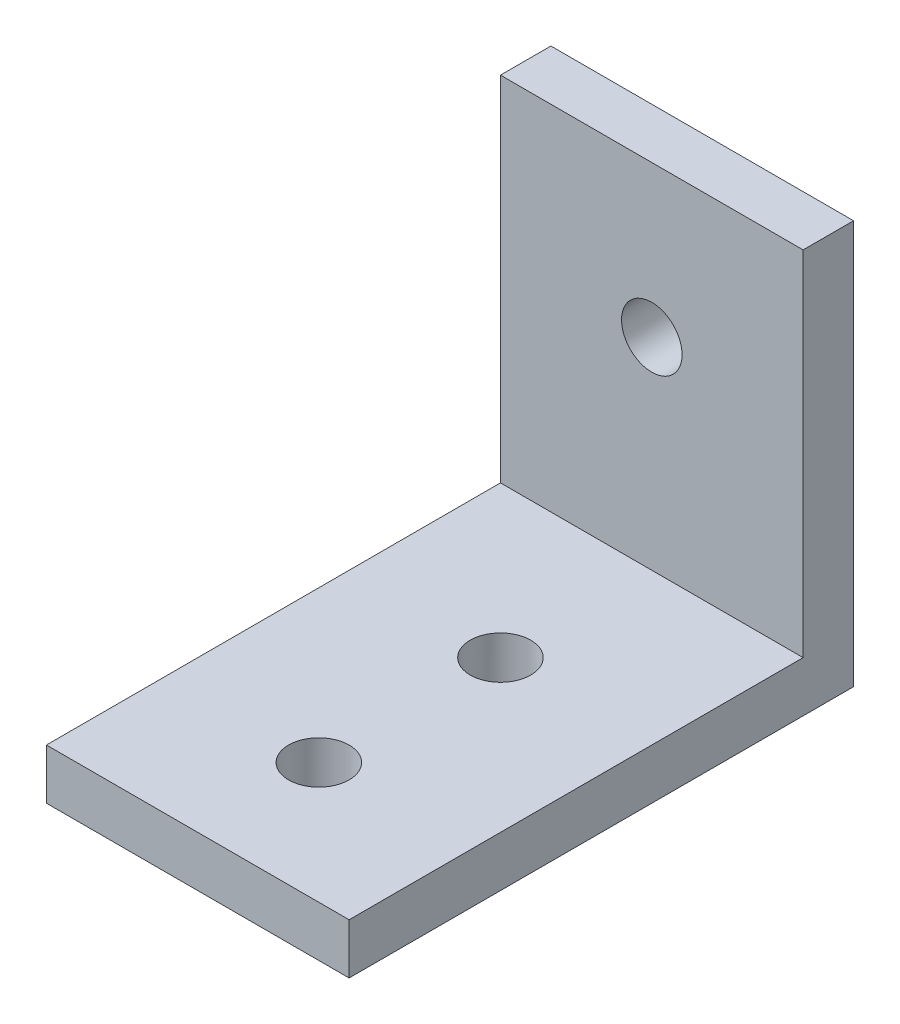
ISO-10303-21;
HEADER;
FILE_DESCRIPTION(('STEP AP214'),'2;1');
FILE_NAME('part.step','',(''),(''),'','','');
FILE_SCHEMA(('AUTOMOTIVE_DESIGN { 1 0 10303 214 1 1 1 1 }'));
ENDSEC;
DATA;
#1=APPLICATION_CONTEXT('core data for automotive mechanical design processes');
#2=APPLICATION_PROTOCOL_DEFINITION('international standard','automotive_design',2000,#1);
#3=PRODUCT_CONTEXT('',#1,'mechanical');
#4=PRODUCT('Part','Part','',(#3));
#5=PRODUCT_RELATED_PRODUCT_CATEGORY('part','',(#4));
#6=PRODUCT_DEFINITION_FORMATION('','',#4);
#7=PRODUCT_DEFINITION_CONTEXT('part definition',#1,'design');
#8=PRODUCT_DEFINITION('design','',#6,#7);
#9=PRODUCT_DEFINITION_SHAPE('','',#8);
#10=(LENGTH_UNIT() NAMED_UNIT(*) SI_UNIT(.MILLI.,.METRE.));
#11=(NAMED_UNIT(*) PLANE_ANGLE_UNIT() SI_UNIT($,.RADIAN.));
#12=(NAMED_UNIT(*) SI_UNIT($,.STERADIAN.) SOLID_ANGLE_UNIT());
#13=UNCERTAINTY_MEASURE_WITH_UNIT(LENGTH_MEASURE(1.E-05),#10,'distance_accuracy_value','');
#14=(GEOMETRIC_REPRESENTATION_CONTEXT(3) GLOBAL_UNCERTAINTY_ASSIGNED_CONTEXT((#13)) GLOBAL_UNIT_ASSIGNED_CONTEXT((#10,
#11,#12)) REPRESENTATION_CONTEXT('',''));
#15=CARTESIAN_POINT('',(0.,0.,0.));
#16=DIRECTION('',(0.,0.,1.));
#17=DIRECTION('',(1.,0.,0.));
#18=AXIS2_PLACEMENT_3D('',#15,#16,#17);
#19=CARTESIAN_POINT('',(-15.,5.,50.));
#20=DIRECTION('',(1.,0.,0.));
#21=DIRECTION('',(0.,0.,-1.));
#22=AXIS2_PLACEMENT_3D('',#19,#20,#21);
#23=PLANE('',#22);
#24=DIRECTION('',(0.,0.,1.));
#25=VECTOR('',#24,1.);
#26=CARTESIAN_POINT('',(-15.,5.,50.));
#27=LINE('',#26,#25);
#28=CARTESIAN_POINT('',(-15.,5.,5.));
#29=VERTEX_POINT('',#28);
#30=CARTESIAN_POINT('',(-15.,5.,50.));
#31=VERTEX_POINT('',#30);
#32=EDGE_CURVE('E142',#29,#31,#27,.T.);
#33=ORIENTED_EDGE('',*,*,#32,.F.);
#34=DIRECTION('',(0.,-1.,0.));
#35=VECTOR('',#34,1.);
#36=CARTESIAN_POINT('',(-15.,40.,5.));
#37=LINE('',#36,#35);
#38=CARTESIAN_POINT('',(-15.,40.,5.));
#39=VERTEX_POINT('',#38);
#40=EDGE_CURVE('E112',#39,#29,#37,.T.);
#41=ORIENTED_EDGE('',*,*,#40,.F.);
#42=DIRECTION('',(0.,0.,-1.));
#43=VECTOR('',#42,1.);
#44=CARTESIAN_POINT('',(-15.,40.,5.));
#45=LINE('',#44,#43);
#46=CARTESIAN_POINT('',(-15.,40.,0.));
#47=VERTEX_POINT('',#46);
#48=EDGE_CURVE('E123',#39,#47,#45,.T.);
#49=ORIENTED_EDGE('',*,*,#48,.T.);
#50=DIRECTION('',(0.,-1.,0.));
#51=VECTOR('',#50,1.);
#52=CARTESIAN_POINT('',(-15.,5.,0.));
#53=LINE('',#52,#51);
#54=CARTESIAN_POINT('',(-15.,0.,0.));
#55=VERTEX_POINT('',#54);
#56=EDGE_CURVE('E151',#47,#55,#53,.T.);
#57=ORIENTED_EDGE('',*,*,#56,.T.);
#58=DIRECTION('',(0.,0.,1.));
#59=VECTOR('',#58,1.);
#60=CARTESIAN_POINT('',(-15.,0.,50.));
#61=LINE('',#60,#59);
#62=CARTESIAN_POINT('',(-15.,0.,50.));
#63=VERTEX_POINT('',#62);
#64=EDGE_CURVE('E141',#55,#63,#61,.T.);
#65=ORIENTED_EDGE('',*,*,#64,.T.);
#66=DIRECTION('',(0.,-1.,0.));
#67=VECTOR('',#66,1.);
#68=CARTESIAN_POINT('',(-15.,5.,50.));
#69=LINE('',#68,#67);
#70=EDGE_CURVE('E11',#31,#63,#69,.T.);
#71=ORIENTED_EDGE('',*,*,#70,.F.);
#72=EDGE_LOOP('',(#33,#41,#49,#57,#65,#71));
#73=FACE_BOUND('',#72,.T.);
#74=ADVANCED_FACE('F51',(#73),#23,.F.);
#75=CARTESIAN_POINT('',(15.,5.,50.));
#76=DIRECTION('',(0.,0.,-1.));
#77=DIRECTION('',(-1.,0.,0.));
#78=AXIS2_PLACEMENT_3D('',#75,#76,#77);
#79=PLANE('',#78);
#80=DIRECTION('',(1.,0.,0.));
#81=VECTOR('',#80,1.);
#82=CARTESIAN_POINT('',(15.,0.,50.));
#83=LINE('',#82,#81);
#84=CARTESIAN_POINT('',(15.,0.,50.));
#85=VERTEX_POINT('',#84);
#86=EDGE_CURVE('E154',#63,#85,#83,.T.);
#87=ORIENTED_EDGE('',*,*,#86,.T.);
#88=DIRECTION('',(0.,-1.,0.));
#89=VECTOR('',#88,1.);
#90=CARTESIAN_POINT('',(15.,5.,50.));
#91=LINE('',#90,#89);
#92=CARTESIAN_POINT('',(15.,5.,50.));
#93=VERTEX_POINT('',#92);
#94=EDGE_CURVE('E61',#93,#85,#91,.T.);
#95=ORIENTED_EDGE('',*,*,#94,.F.);
#96=DIRECTION('',(1.,0.,0.));
#97=VECTOR('',#96,1.);
#98=CARTESIAN_POINT('',(15.,5.,50.));
#99=LINE('',#98,#97);
#100=EDGE_CURVE('E145',#31,#93,#99,.T.);
#101=ORIENTED_EDGE('',*,*,#100,.F.);
#102=ORIENTED_EDGE('',*,*,#70,.T.);
#103=EDGE_LOOP('',(#87,#95,#101,#102));
#104=FACE_BOUND('',#103,.T.);
#105=ADVANCED_FACE('F220',(#104),#79,.F.);
#106=CARTESIAN_POINT('',(15.,5.,0.));
#107=DIRECTION('',(-1.,0.,0.));
#108=DIRECTION('',(0.,0.,1.));
#109=AXIS2_PLACEMENT_3D('',#106,#107,#108);
#110=PLANE('',#109);
#111=DIRECTION('',(0.,0.,-1.));
#112=VECTOR('',#111,1.);
#113=CARTESIAN_POINT('',(15.,0.,0.));
#114=LINE('',#113,#112);
#115=CARTESIAN_POINT('',(15.,0.,0.));
#116=VERTEX_POINT('',#115);
#117=EDGE_CURVE('E157',#85,#116,#114,.T.);
#118=ORIENTED_EDGE('',*,*,#117,.T.);
#119=DIRECTION('',(0.,-1.,0.));
#120=VECTOR('',#119,1.);
#121=CARTESIAN_POINT('',(15.,5.,0.));
#122=LINE('',#121,#120);
#123=CARTESIAN_POINT('',(15.,40.,0.));
#124=VERTEX_POINT('',#123);
#125=EDGE_CURVE('E118',#124,#116,#122,.T.);
#126=ORIENTED_EDGE('',*,*,#125,.F.);
#127=DIRECTION('',(0.,0.,-1.));
#128=VECTOR('',#127,1.);
#129=CARTESIAN_POINT('',(15.,40.,5.));
#130=LINE('',#129,#128);
#131=CARTESIAN_POINT('',(15.,40.,5.));
#132=VERTEX_POINT('',#131);
#133=EDGE_CURVE('E115',#132,#124,#130,.T.);
#134=ORIENTED_EDGE('',*,*,#133,.F.);
#135=DIRECTION('',(0.,1.,0.));
#136=VECTOR('',#135,1.);
#137=CARTESIAN_POINT('',(15.,0.,5.));
#138=LINE('',#137,#136);
#139=CARTESIAN_POINT('',(15.,5.,5.));
#140=VERTEX_POINT('',#139);
#141=EDGE_CURVE('E103',#140,#132,#138,.T.);
#142=ORIENTED_EDGE('',*,*,#141,.F.);
#143=DIRECTION('',(0.,0.,-1.));
#144=VECTOR('',#143,1.);
#145=CARTESIAN_POINT('',(15.,5.,0.));
#146=LINE('',#145,#144);
#147=EDGE_CURVE('E68',#93,#140,#146,.T.);
#148=ORIENTED_EDGE('',*,*,#147,.F.);
#149=ORIENTED_EDGE('',*,*,#94,.T.);
#150=EDGE_LOOP('',(#118,#126,#134,#142,#148,#149));
#151=FACE_BOUND('',#150,.T.);
#152=ADVANCED_FACE('F116',(#151),#110,.F.);
#153=CARTESIAN_POINT('',(-15.,5.,0.));
#154=DIRECTION('',(0.,0.,1.));
#155=DIRECTION('',(1.,0.,0.));
#156=AXIS2_PLACEMENT_3D('',#153,#154,#155);
#157=PLANE('',#156);
#158=CARTESIAN_POINT('',(0.,25.,0.));
#159=DIRECTION('',(0.,0.,1.));
#160=DIRECTION('',(1.,0.,0.));
#161=AXIS2_PLACEMENT_3D('',#158,#159,#160);
#162=CIRCLE('',#161,3.);
#163=CARTESIAN_POINT('',(3.,25.,0.));
#164=VERTEX_POINT('',#163);
#165=EDGE_CURVE('E200',#164,#164,#162,.T.);
#166=ORIENTED_EDGE('',*,*,#165,.T.);
#167=EDGE_LOOP('',(#166));
#168=FACE_BOUND('',#167,.T.);
#169=DIRECTION('',(-1.,0.,0.));
#170=VECTOR('',#169,1.);
#171=CARTESIAN_POINT('',(-15.,0.,0.));
#172=LINE('',#171,#170);
#173=EDGE_CURVE('E146',#116,#55,#172,.T.);
#174=ORIENTED_EDGE('',*,*,#173,.T.);
#175=ORIENTED_EDGE('',*,*,#56,.F.);
#176=DIRECTION('',(-1.,0.,0.));
#177=VECTOR('',#176,1.);
#178=CARTESIAN_POINT('',(15.,40.,0.));
#179=LINE('',#178,#177);
#180=EDGE_CURVE('E135',#124,#47,#179,.T.);
#181=ORIENTED_EDGE('',*,*,#180,.F.);
#182=ORIENTED_EDGE('',*,*,#125,.T.);
#183=EDGE_LOOP('',(#174,#175,#181,#182));
#184=FACE_BOUND('',#183,.T.);
#185=ADVANCED_FACE('F181',(#168,#184),#157,.F.);
#186=CARTESIAN_POINT('',(0.,5.,0.));
#187=DIRECTION('',(0.,-1.,0.));
#188=DIRECTION('',(0.,0.,-1.));
#189=AXIS2_PLACEMENT_3D('',#186,#187,#188);
#190=PLANE('',#189);
#191=CARTESIAN_POINT('',(0.,5.,20.));
#192=DIRECTION('',(0.,-1.,0.));
#193=DIRECTION('',(0.,0.,-1.));
#194=AXIS2_PLACEMENT_3D('',#191,#192,#193);
#195=CIRCLE('',#194,3.);
#196=CARTESIAN_POINT('',(0.,5.,17.));
#197=VERTEX_POINT('',#196);
#198=EDGE_CURVE('E137',#197,#197,#195,.F.);
#199=ORIENTED_EDGE('',*,*,#198,.F.);
#200=EDGE_LOOP('',(#199));
#201=FACE_BOUND('',#200,.T.);
#202=CARTESIAN_POINT('',(0.,5.,38.));
#203=DIRECTION('',(0.,-1.,0.));
#204=DIRECTION('',(0.,0.,-1.));
#205=AXIS2_PLACEMENT_3D('',#202,#203,#204);
#206=CIRCLE('',#205,3.);
#207=CARTESIAN_POINT('',(0.,5.,35.));
#208=VERTEX_POINT('',#207);
#209=EDGE_CURVE('E188',#208,#208,#206,.F.);
#210=ORIENTED_EDGE('',*,*,#209,.F.);
#211=EDGE_LOOP('',(#210));
#212=FACE_BOUND('',#211,.T.);
#213=ORIENTED_EDGE('',*,*,#147,.T.);
#214=DIRECTION('',(-1.,0.,0.));
#215=VECTOR('',#214,1.);
#216=CARTESIAN_POINT('',(0.,5.,5.));
#217=LINE('',#216,#215);
#218=EDGE_CURVE('E72',#140,#29,#217,.T.);
#219=ORIENTED_EDGE('',*,*,#218,.T.);
#220=ORIENTED_EDGE('',*,*,#32,.T.);
#221=ORIENTED_EDGE('',*,*,#100,.T.);
#222=EDGE_LOOP('',(#213,#219,#220,#221));
#223=FACE_BOUND('',#222,.T.);
#224=ADVANCED_FACE('F233',(#201,#212,#223),#190,.F.);
#225=CARTESIAN_POINT('',(0.,0.,0.));
#226=DIRECTION('',(0.,-1.,0.));
#227=DIRECTION('',(0.,0.,-1.));
#228=AXIS2_PLACEMENT_3D('',#225,#226,#227);
#229=PLANE('',#228);
#230=CARTESIAN_POINT('',(0.,0.,20.));
#231=DIRECTION('',(0.,1.,0.));
#232=DIRECTION('',(0.,0.,1.));
#233=AXIS2_PLACEMENT_3D('',#230,#231,#232);
#234=CIRCLE('',#233,3.);
#235=CARTESIAN_POINT('',(0.,0.,23.));
#236=VERTEX_POINT('',#235);
#237=EDGE_CURVE('E192',#236,#236,#234,.T.);
#238=ORIENTED_EDGE('',*,*,#237,.T.);
#239=EDGE_LOOP('',(#238));
#240=FACE_BOUND('',#239,.T.);
#241=CARTESIAN_POINT('',(0.,0.,38.));
#242=DIRECTION('',(0.,1.,0.));
#243=DIRECTION('',(0.,0.,1.));
#244=AXIS2_PLACEMENT_3D('',#241,#242,#243);
#245=CIRCLE('',#244,3.);
#246=CARTESIAN_POINT('',(0.,0.,41.));
#247=VERTEX_POINT('',#246);
#248=EDGE_CURVE('E193',#247,#247,#245,.T.);
#249=ORIENTED_EDGE('',*,*,#248,.T.);
#250=EDGE_LOOP('',(#249));
#251=FACE_BOUND('',#250,.T.);
#252=ORIENTED_EDGE('',*,*,#86,.F.);
#253=ORIENTED_EDGE('',*,*,#64,.F.);
#254=ORIENTED_EDGE('',*,*,#173,.F.);
#255=ORIENTED_EDGE('',*,*,#117,.F.);
#256=EDGE_LOOP('',(#252,#253,#254,#255));
#257=FACE_BOUND('',#256,.T.);
#258=ADVANCED_FACE('F178',(#240,#251,#257),#229,.T.);
#259=CARTESIAN_POINT('',(0.,0.,5.));
#260=DIRECTION('',(0.,0.,1.));
#261=DIRECTION('',(1.,0.,0.));
#262=AXIS2_PLACEMENT_3D('',#259,#260,#261);
#263=PLANE('',#262);
#264=CARTESIAN_POINT('',(0.,25.,5.));
#265=DIRECTION('',(0.,0.,1.));
#266=DIRECTION('',(1.,0.,0.));
#267=AXIS2_PLACEMENT_3D('',#264,#265,#266);
#268=CIRCLE('',#267,3.);
#269=CARTESIAN_POINT('',(3.,25.,5.));
#270=VERTEX_POINT('',#269);
#271=EDGE_CURVE('E55',#270,#270,#268,.F.);
#272=ORIENTED_EDGE('',*,*,#271,.T.);
#273=EDGE_LOOP('',(#272));
#274=FACE_BOUND('',#273,.T.);
#275=ORIENTED_EDGE('',*,*,#218,.F.);
#276=ORIENTED_EDGE('',*,*,#141,.T.);
#277=DIRECTION('',(-1.,0.,0.));
#278=VECTOR('',#277,1.);
#279=CARTESIAN_POINT('',(15.,40.,5.));
#280=LINE('',#279,#278);
#281=EDGE_CURVE('E108',#132,#39,#280,.T.);
#282=ORIENTED_EDGE('',*,*,#281,.T.);
#283=ORIENTED_EDGE('',*,*,#40,.T.);
#284=EDGE_LOOP('',(#275,#276,#282,#283));
#285=FACE_BOUND('',#284,.T.);
#286=ADVANCED_FACE('F105',(#274,#285),#263,.T.);
#287=CARTESIAN_POINT('',(15.,40.,5.));
#288=DIRECTION('',(0.,-1.,0.));
#289=DIRECTION('',(0.,0.,-1.));
#290=AXIS2_PLACEMENT_3D('',#287,#288,#289);
#291=PLANE('',#290);
#292=ORIENTED_EDGE('',*,*,#180,.T.);
#293=ORIENTED_EDGE('',*,*,#48,.F.);
#294=ORIENTED_EDGE('',*,*,#281,.F.);
#295=ORIENTED_EDGE('',*,*,#133,.T.);
#296=EDGE_LOOP('',(#292,#293,#294,#295));
#297=FACE_BOUND('',#296,.T.);
#298=ADVANCED_FACE('F125',(#297),#291,.F.);
#299=CARTESIAN_POINT('',(0.,40.,38.));
#300=DIRECTION('',(0.,-1.,0.));
#301=DIRECTION('',(0.,0.,-1.));
#302=AXIS2_PLACEMENT_3D('',#299,#300,#301);
#303=CYLINDRICAL_SURFACE('',#302,3.);
#304=ORIENTED_EDGE('',*,*,#248,.F.);
#305=EDGE_LOOP('',(#304));
#306=FACE_BOUND('',#305,.T.);
#307=ORIENTED_EDGE('',*,*,#209,.T.);
#308=EDGE_LOOP('',(#307));
#309=FACE_BOUND('',#308,.T.);
#310=ADVANCED_FACE('F215',(#306,#309),#303,.F.);
#311=CARTESIAN_POINT('',(0.,40.,20.));
#312=DIRECTION('',(0.,-1.,0.));
#313=DIRECTION('',(0.,0.,-1.));
#314=AXIS2_PLACEMENT_3D('',#311,#312,#313);
#315=CYLINDRICAL_SURFACE('',#314,3.);
#316=ORIENTED_EDGE('',*,*,#237,.F.);
#317=EDGE_LOOP('',(#316));
#318=FACE_BOUND('',#317,.T.);
#319=ORIENTED_EDGE('',*,*,#198,.T.);
#320=EDGE_LOOP('',(#319));
#321=FACE_BOUND('',#320,.T.);
#322=ADVANCED_FACE('F211',(#318,#321),#315,.F.);
#323=CARTESIAN_POINT('',(0.,25.,50.));
#324=DIRECTION('',(0.,0.,-1.));
#325=DIRECTION('',(-1.,0.,0.));
#326=AXIS2_PLACEMENT_3D('',#323,#324,#325);
#327=CYLINDRICAL_SURFACE('',#326,3.);
#328=ORIENTED_EDGE('',*,*,#271,.F.);
#329=EDGE_LOOP('',(#328));
#330=FACE_BOUND('',#329,.T.);
#331=ORIENTED_EDGE('',*,*,#165,.F.);
#332=EDGE_LOOP('',(#331));
#333=FACE_BOUND('',#332,.T.);
#334=ADVANCED_FACE('F208',(#330,#333),#327,.F.);
#335=CLOSED_SHELL('',(#74,#105,#152,#185,#224,#258,#286,#298,#310,#322,#334));
#336=MANIFOLD_SOLID_BREP('B2',#335);
#337=ADVANCED_BREP_SHAPE_REPRESENTATION('',(#18,#336),#14);
#338=SHAPE_DEFINITION_REPRESENTATION(#9,#337);
ENDSEC;
END-ISO-10303-21;
